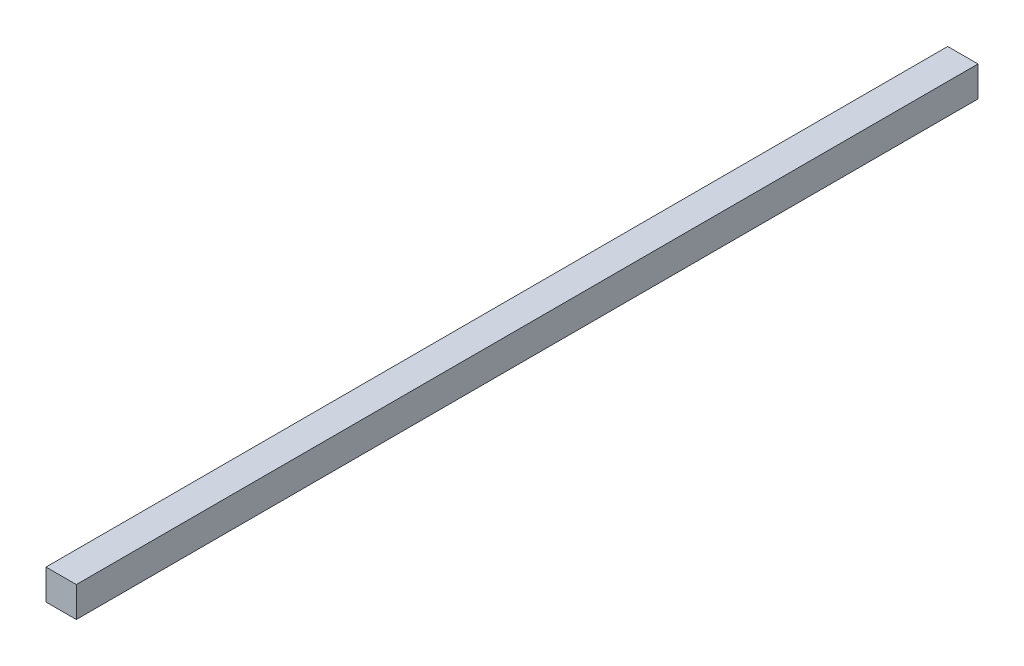
ISO-10303-21;
HEADER;
FILE_DESCRIPTION(('STEP AP214'),'2;1');
FILE_NAME('part.step','',(''),(''),'','','');
FILE_SCHEMA(('AUTOMOTIVE_DESIGN { 1 0 10303 214 1 1 1 1 }'));
ENDSEC;
DATA;
#1=APPLICATION_CONTEXT('core data for automotive mechanical design processes');
#2=APPLICATION_PROTOCOL_DEFINITION('international standard','automotive_design',2000,#1);
#3=PRODUCT_CONTEXT('',#1,'mechanical');
#4=PRODUCT('Part','Part','',(#3));
#5=PRODUCT_RELATED_PRODUCT_CATEGORY('part','',(#4));
#6=PRODUCT_DEFINITION_FORMATION('','',#4);
#7=PRODUCT_DEFINITION_CONTEXT('part definition',#1,'design');
#8=PRODUCT_DEFINITION('design','',#6,#7);
#9=PRODUCT_DEFINITION_SHAPE('','',#8);
#10=(LENGTH_UNIT() NAMED_UNIT(*) SI_UNIT(.MILLI.,.METRE.));
#11=(NAMED_UNIT(*) PLANE_ANGLE_UNIT() SI_UNIT($,.RADIAN.));
#12=(NAMED_UNIT(*) SI_UNIT($,.STERADIAN.) SOLID_ANGLE_UNIT());
#13=UNCERTAINTY_MEASURE_WITH_UNIT(LENGTH_MEASURE(1.E-05),#10,'distance_accuracy_value','');
#14=(GEOMETRIC_REPRESENTATION_CONTEXT(3) GLOBAL_UNCERTAINTY_ASSIGNED_CONTEXT((#13)) GLOBAL_UNIT_ASSIGNED_CONTEXT((#10,
#11,#12)) REPRESENTATION_CONTEXT('',''));
#15=CARTESIAN_POINT('',(0.,0.,0.));
#16=DIRECTION('',(0.,0.,1.));
#17=DIRECTION('',(1.,0.,0.));
#18=AXIS2_PLACEMENT_3D('',#15,#16,#17);
#19=CARTESIAN_POINT('',(10.,-10.,595.));
#20=DIRECTION('',(-1.,0.,0.));
#21=DIRECTION('',(0.,0.,1.));
#22=AXIS2_PLACEMENT_3D('',#19,#20,#21);
#23=PLANE('',#22);
#24=DIRECTION('',(0.,1.,0.));
#25=VECTOR('',#24,1.);
#26=CARTESIAN_POINT('',(10.,-10.,0.));
#27=LINE('',#26,#25);
#28=CARTESIAN_POINT('',(10.,-10.,0.));
#29=VERTEX_POINT('',#28);
#30=CARTESIAN_POINT('',(10.,10.,0.));
#31=VERTEX_POINT('',#30);
#32=EDGE_CURVE('E96',#29,#31,#27,.T.);
#33=ORIENTED_EDGE('',*,*,#32,.T.);
#34=DIRECTION('',(0.,0.,-1.));
#35=VECTOR('',#34,1.);
#36=CARTESIAN_POINT('',(10.,10.,595.));
#37=LINE('',#36,#35);
#38=CARTESIAN_POINT('',(10.,10.,595.));
#39=VERTEX_POINT('',#38);
#40=EDGE_CURVE('E11',#39,#31,#37,.T.);
#41=ORIENTED_EDGE('',*,*,#40,.F.);
#42=DIRECTION('',(0.,1.,0.));
#43=VECTOR('',#42,1.);
#44=CARTESIAN_POINT('',(10.,-10.,595.));
#45=LINE('',#44,#43);
#46=CARTESIAN_POINT('',(10.,-10.,595.));
#47=VERTEX_POINT('',#46);
#48=EDGE_CURVE('E84',#47,#39,#45,.T.);
#49=ORIENTED_EDGE('',*,*,#48,.F.);
#50=DIRECTION('',(0.,0.,-1.));
#51=VECTOR('',#50,1.);
#52=CARTESIAN_POINT('',(10.,-10.,595.));
#53=LINE('',#52,#51);
#54=EDGE_CURVE('E92',#47,#29,#53,.T.);
#55=ORIENTED_EDGE('',*,*,#54,.T.);
#56=EDGE_LOOP('',(#33,#41,#49,#55));
#57=FACE_BOUND('',#56,.T.);
#58=ADVANCED_FACE('F33',(#57),#23,.F.);
#59=CARTESIAN_POINT('',(-10.,10.,595.));
#60=DIRECTION('',(0.,-1.,0.));
#61=DIRECTION('',(0.,0.,-1.));
#62=AXIS2_PLACEMENT_3D('',#59,#60,#61);
#63=PLANE('',#62);
#64=DIRECTION('',(-1.,0.,0.));
#65=VECTOR('',#64,1.);
#66=CARTESIAN_POINT('',(-10.,10.,0.));
#67=LINE('',#66,#65);
#68=CARTESIAN_POINT('',(-10.,10.,0.));
#69=VERTEX_POINT('',#68);
#70=EDGE_CURVE('E88',#31,#69,#67,.T.);
#71=ORIENTED_EDGE('',*,*,#70,.T.);
#72=DIRECTION('',(0.,0.,-1.));
#73=VECTOR('',#72,1.);
#74=CARTESIAN_POINT('',(-10.,10.,595.));
#75=LINE('',#74,#73);
#76=CARTESIAN_POINT('',(-10.,10.,595.));
#77=VERTEX_POINT('',#76);
#78=EDGE_CURVE('E41',#77,#69,#75,.T.);
#79=ORIENTED_EDGE('',*,*,#78,.F.);
#80=DIRECTION('',(-1.,0.,0.));
#81=VECTOR('',#80,1.);
#82=CARTESIAN_POINT('',(-10.,10.,595.));
#83=LINE('',#82,#81);
#84=EDGE_CURVE('E79',#39,#77,#83,.T.);
#85=ORIENTED_EDGE('',*,*,#84,.F.);
#86=ORIENTED_EDGE('',*,*,#40,.T.);
#87=EDGE_LOOP('',(#71,#79,#85,#86));
#88=FACE_BOUND('',#87,.T.);
#89=ADVANCED_FACE('F87',(#88),#63,.F.);
#90=CARTESIAN_POINT('',(-10.,-10.,595.));
#91=DIRECTION('',(1.,0.,0.));
#92=DIRECTION('',(0.,0.,-1.));
#93=AXIS2_PLACEMENT_3D('',#90,#91,#92);
#94=PLANE('',#93);
#95=DIRECTION('',(0.,-1.,0.));
#96=VECTOR('',#95,1.);
#97=CARTESIAN_POINT('',(-10.,-10.,0.));
#98=LINE('',#97,#96);
#99=CARTESIAN_POINT('',(-10.,-10.,0.));
#100=VERTEX_POINT('',#99);
#101=EDGE_CURVE('E66',#69,#100,#98,.T.);
#102=ORIENTED_EDGE('',*,*,#101,.T.);
#103=DIRECTION('',(0.,0.,-1.));
#104=VECTOR('',#103,1.);
#105=CARTESIAN_POINT('',(-10.,-10.,595.));
#106=LINE('',#105,#104);
#107=CARTESIAN_POINT('',(-10.,-10.,595.));
#108=VERTEX_POINT('',#107);
#109=EDGE_CURVE('E89',#108,#100,#106,.T.);
#110=ORIENTED_EDGE('',*,*,#109,.F.);
#111=DIRECTION('',(0.,-1.,0.));
#112=VECTOR('',#111,1.);
#113=CARTESIAN_POINT('',(-10.,-10.,595.));
#114=LINE('',#113,#112);
#115=EDGE_CURVE('E82',#77,#108,#114,.T.);
#116=ORIENTED_EDGE('',*,*,#115,.F.);
#117=ORIENTED_EDGE('',*,*,#78,.T.);
#118=EDGE_LOOP('',(#102,#110,#116,#117));
#119=FACE_BOUND('',#118,.T.);
#120=ADVANCED_FACE('F90',(#119),#94,.F.);
#121=CARTESIAN_POINT('',(-10.,-10.,595.));
#122=DIRECTION('',(0.,1.,0.));
#123=DIRECTION('',(0.,0.,1.));
#124=AXIS2_PLACEMENT_3D('',#121,#122,#123);
#125=PLANE('',#124);
#126=DIRECTION('',(1.,0.,0.));
#127=VECTOR('',#126,1.);
#128=CARTESIAN_POINT('',(-10.,-10.,0.));
#129=LINE('',#128,#127);
#130=EDGE_CURVE('E72',#100,#29,#129,.T.);
#131=ORIENTED_EDGE('',*,*,#130,.T.);
#132=ORIENTED_EDGE('',*,*,#54,.F.);
#133=DIRECTION('',(1.,0.,0.));
#134=VECTOR('',#133,1.);
#135=CARTESIAN_POINT('',(-10.,-10.,595.));
#136=LINE('',#135,#134);
#137=EDGE_CURVE('E49',#108,#47,#136,.T.);
#138=ORIENTED_EDGE('',*,*,#137,.F.);
#139=ORIENTED_EDGE('',*,*,#109,.T.);
#140=EDGE_LOOP('',(#131,#132,#138,#139));
#141=FACE_BOUND('',#140,.T.);
#142=ADVANCED_FACE('F103',(#141),#125,.F.);
#143=CARTESIAN_POINT('',(0.,0.,595.));
#144=DIRECTION('',(0.,0.,-1.));
#145=DIRECTION('',(-1.,0.,0.));
#146=AXIS2_PLACEMENT_3D('',#143,#144,#145);
#147=PLANE('',#146);
#148=ORIENTED_EDGE('',*,*,#48,.T.);
#149=ORIENTED_EDGE('',*,*,#84,.T.);
#150=ORIENTED_EDGE('',*,*,#115,.T.);
#151=ORIENTED_EDGE('',*,*,#137,.T.);
#152=EDGE_LOOP('',(#148,#149,#150,#151));
#153=FACE_BOUND('',#152,.T.);
#154=ADVANCED_FACE('F80',(#153),#147,.F.);
#155=CARTESIAN_POINT('',(0.,0.,0.));
#156=DIRECTION('',(0.,0.,-1.));
#157=DIRECTION('',(-1.,0.,0.));
#158=AXIS2_PLACEMENT_3D('',#155,#156,#157);
#159=PLANE('',#158);
#160=ORIENTED_EDGE('',*,*,#32,.F.);
#161=ORIENTED_EDGE('',*,*,#130,.F.);
#162=ORIENTED_EDGE('',*,*,#101,.F.);
#163=ORIENTED_EDGE('',*,*,#70,.F.);
#164=EDGE_LOOP('',(#160,#161,#162,#163));
#165=FACE_BOUND('',#164,.T.);
#166=ADVANCED_FACE('F106',(#165),#159,.T.);
#167=CLOSED_SHELL('',(#58,#89,#120,#142,#154,#166));
#168=MANIFOLD_SOLID_BREP('B2',#167);
#169=ADVANCED_BREP_SHAPE_REPRESENTATION('',(#18,#168),#14);
#170=SHAPE_DEFINITION_REPRESENTATION(#9,#169);
ENDSEC;
END-ISO-10303-21;
